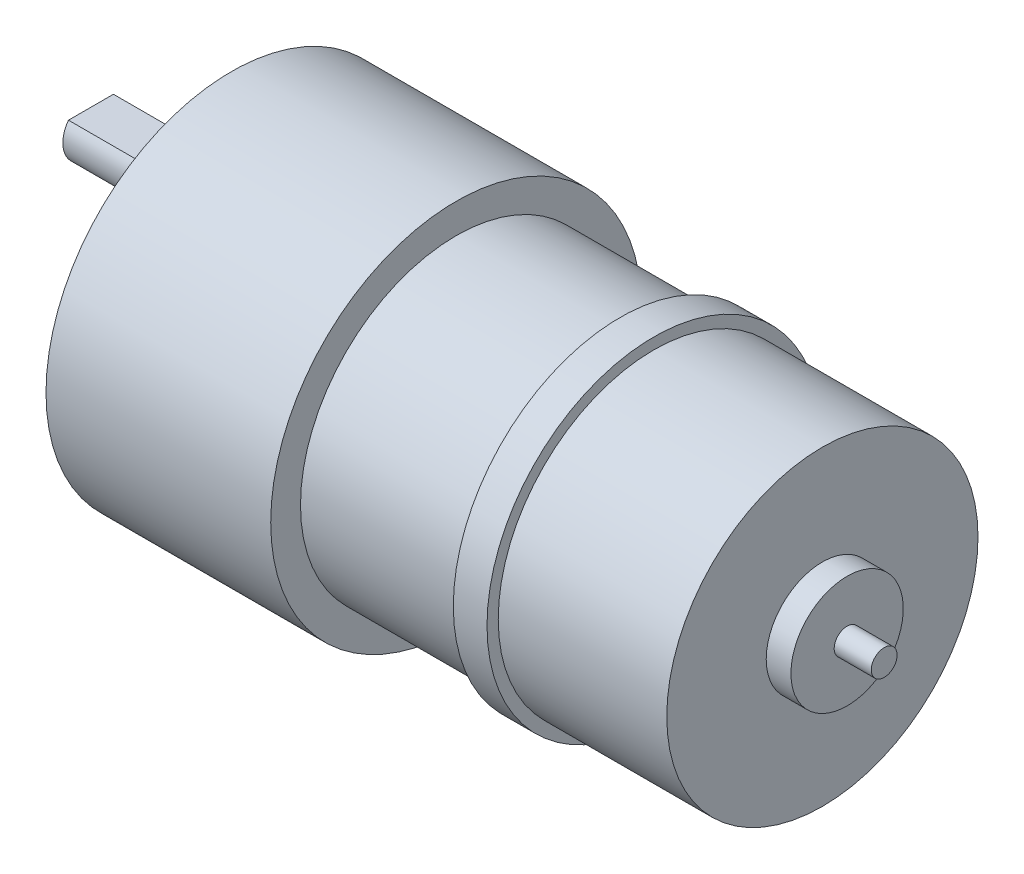
ISO-10303-21;
HEADER;
FILE_DESCRIPTION(('STEP AP214'),'2;1');
FILE_NAME('part.step','',(''),(''),'','','');
FILE_SCHEMA(('AUTOMOTIVE_DESIGN { 1 0 10303 214 1 1 1 1 }'));
ENDSEC;
DATA;
#1=APPLICATION_CONTEXT('core data for automotive mechanical design processes');
#2=APPLICATION_PROTOCOL_DEFINITION('international standard','automotive_design',2000,#1);
#3=PRODUCT_CONTEXT('',#1,'mechanical');
#4=PRODUCT('Part','Part','',(#3));
#5=PRODUCT_RELATED_PRODUCT_CATEGORY('part','',(#4));
#6=PRODUCT_DEFINITION_FORMATION('','',#4);
#7=PRODUCT_DEFINITION_CONTEXT('part definition',#1,'design');
#8=PRODUCT_DEFINITION('design','',#6,#7);
#9=PRODUCT_DEFINITION_SHAPE('','',#8);
#10=(LENGTH_UNIT() NAMED_UNIT(*) SI_UNIT(.MILLI.,.METRE.));
#11=(NAMED_UNIT(*) PLANE_ANGLE_UNIT() SI_UNIT($,.RADIAN.));
#12=(NAMED_UNIT(*) SI_UNIT($,.STERADIAN.) SOLID_ANGLE_UNIT());
#13=UNCERTAINTY_MEASURE_WITH_UNIT(LENGTH_MEASURE(1.E-05),#10,'distance_accuracy_value','');
#14=(GEOMETRIC_REPRESENTATION_CONTEXT(3) GLOBAL_UNCERTAINTY_ASSIGNED_CONTEXT((#13)) GLOBAL_UNIT_ASSIGNED_CONTEXT((#10,
#11,#12)) REPRESENTATION_CONTEXT('',''));
#15=CARTESIAN_POINT('',(0.,0.,0.));
#16=DIRECTION('',(0.,0.,1.));
#17=DIRECTION('',(1.,0.,0.));
#18=AXIS2_PLACEMENT_3D('',#15,#16,#17);
#19=CARTESIAN_POINT('',(58.1,0.,0.));
#20=DIRECTION('',(-1.,0.,0.));
#21=DIRECTION('',(0.,0.,1.));
#22=AXIS2_PLACEMENT_3D('',#19,#20,#21);
#23=PLANE('',#22);
#24=CARTESIAN_POINT('',(58.1,0.,0.));
#25=DIRECTION('',(-1.,0.,0.));
#26=DIRECTION('',(0.,0.,1.));
#27=AXIS2_PLACEMENT_3D('',#24,#25,#26);
#28=CIRCLE('',#27,1.15);
#29=CARTESIAN_POINT('',(58.1,0.,1.15));
#30=VERTEX_POINT('',#29);
#31=EDGE_CURVE('E11',#30,#30,#28,.T.);
#32=ORIENTED_EDGE('',*,*,#31,.F.);
#33=EDGE_LOOP('',(#32));
#34=FACE_BOUND('',#33,.T.);
#35=ADVANCED_FACE('F38',(#34),#23,.F.);
#36=CARTESIAN_POINT('',(0.,0.,0.));
#37=DIRECTION('',(-1.,0.,0.));
#38=DIRECTION('',(0.,0.,1.));
#39=AXIS2_PLACEMENT_3D('',#36,#37,#38);
#40=CYLINDRICAL_SURFACE('',#39,1.15);
#41=ORIENTED_EDGE('',*,*,#31,.T.);
#42=EDGE_LOOP('',(#41));
#43=FACE_BOUND('',#42,.T.);
#44=CARTESIAN_POINT('',(54.8,0.,0.));
#45=DIRECTION('',(-1.,0.,0.));
#46=DIRECTION('',(0.,0.,1.));
#47=AXIS2_PLACEMENT_3D('',#44,#45,#46);
#48=CIRCLE('',#47,1.15);
#49=CARTESIAN_POINT('',(54.8,0.,1.15));
#50=VERTEX_POINT('',#49);
#51=EDGE_CURVE('E45',#50,#50,#48,.T.);
#52=ORIENTED_EDGE('',*,*,#51,.F.);
#53=EDGE_LOOP('',(#52));
#54=FACE_BOUND('',#53,.T.);
#55=ADVANCED_FACE('F123',(#43,#54),#40,.T.);
#56=CARTESIAN_POINT('',(54.8,0.,0.));
#57=DIRECTION('',(-1.,0.,0.));
#58=DIRECTION('',(0.,0.,1.));
#59=AXIS2_PLACEMENT_3D('',#56,#57,#58);
#60=PLANE('',#59);
#61=CARTESIAN_POINT('',(54.8,0.,0.));
#62=DIRECTION('',(-1.,0.,0.));
#63=DIRECTION('',(0.,0.,1.));
#64=AXIS2_PLACEMENT_3D('',#61,#62,#63);
#65=CIRCLE('',#64,5.);
#66=CARTESIAN_POINT('',(54.8,0.,5.));
#67=VERTEX_POINT('',#66);
#68=EDGE_CURVE('E116',#67,#67,#65,.T.);
#69=ORIENTED_EDGE('',*,*,#68,.F.);
#70=EDGE_LOOP('',(#69));
#71=FACE_BOUND('',#70,.T.);
#72=ORIENTED_EDGE('',*,*,#51,.T.);
#73=EDGE_LOOP('',(#72));
#74=FACE_BOUND('',#73,.T.);
#75=ADVANCED_FACE('F121',(#71,#74),#60,.F.);
#76=CARTESIAN_POINT('',(0.,0.,0.));
#77=DIRECTION('',(-1.,0.,0.));
#78=DIRECTION('',(0.,0.,1.));
#79=AXIS2_PLACEMENT_3D('',#76,#77,#78);
#80=CYLINDRICAL_SURFACE('',#79,5.);
#81=ORIENTED_EDGE('',*,*,#68,.T.);
#82=EDGE_LOOP('',(#81));
#83=FACE_BOUND('',#82,.T.);
#84=CARTESIAN_POINT('',(52.6,0.,0.));
#85=DIRECTION('',(-1.,0.,0.));
#86=DIRECTION('',(0.,0.,1.));
#87=AXIS2_PLACEMENT_3D('',#84,#85,#86);
#88=CIRCLE('',#87,5.);
#89=CARTESIAN_POINT('',(52.6,0.,5.));
#90=VERTEX_POINT('',#89);
#91=EDGE_CURVE('E113',#90,#90,#88,.T.);
#92=ORIENTED_EDGE('',*,*,#91,.F.);
#93=EDGE_LOOP('',(#92));
#94=FACE_BOUND('',#93,.T.);
#95=ADVANCED_FACE('F130',(#83,#94),#80,.T.);
#96=CARTESIAN_POINT('',(52.6,0.,0.));
#97=DIRECTION('',(-1.,0.,0.));
#98=DIRECTION('',(0.,0.,1.));
#99=AXIS2_PLACEMENT_3D('',#96,#97,#98);
#100=PLANE('',#99);
#101=CARTESIAN_POINT('',(52.6,0.,0.));
#102=DIRECTION('',(-1.,0.,0.));
#103=DIRECTION('',(0.,0.,1.));
#104=AXIS2_PLACEMENT_3D('',#101,#102,#103);
#105=CIRCLE('',#104,13.85);
#106=CARTESIAN_POINT('',(52.6,0.,13.85));
#107=VERTEX_POINT('',#106);
#108=EDGE_CURVE('E110',#107,#107,#105,.T.);
#109=ORIENTED_EDGE('',*,*,#108,.F.);
#110=EDGE_LOOP('',(#109));
#111=FACE_BOUND('',#110,.T.);
#112=ORIENTED_EDGE('',*,*,#91,.T.);
#113=EDGE_LOOP('',(#112));
#114=FACE_BOUND('',#113,.T.);
#115=ADVANCED_FACE('F137',(#111,#114),#100,.F.);
#116=CARTESIAN_POINT('',(0.,0.,0.));
#117=DIRECTION('',(-1.,0.,0.));
#118=DIRECTION('',(0.,0.,1.));
#119=AXIS2_PLACEMENT_3D('',#116,#117,#118);
#120=CYLINDRICAL_SURFACE('',#119,13.85);
#121=ORIENTED_EDGE('',*,*,#108,.T.);
#122=EDGE_LOOP('',(#121));
#123=FACE_BOUND('',#122,.T.);
#124=CARTESIAN_POINT('',(37.6,0.,0.));
#125=DIRECTION('',(-1.,0.,0.));
#126=DIRECTION('',(0.,0.,1.));
#127=AXIS2_PLACEMENT_3D('',#124,#125,#126);
#128=CIRCLE('',#127,13.85);
#129=CARTESIAN_POINT('',(37.6,0.,13.85));
#130=VERTEX_POINT('',#129);
#131=EDGE_CURVE('E107',#130,#130,#128,.T.);
#132=ORIENTED_EDGE('',*,*,#131,.F.);
#133=EDGE_LOOP('',(#132));
#134=FACE_BOUND('',#133,.T.);
#135=ADVANCED_FACE('F141',(#123,#134),#120,.T.);
#136=CARTESIAN_POINT('',(37.6,0.,0.));
#137=DIRECTION('',(-1.,0.,0.));
#138=DIRECTION('',(0.,0.,1.));
#139=AXIS2_PLACEMENT_3D('',#136,#137,#138);
#140=PLANE('',#139);
#141=CARTESIAN_POINT('',(37.6,0.,0.));
#142=DIRECTION('',(-1.,0.,0.));
#143=DIRECTION('',(0.,0.,1.));
#144=AXIS2_PLACEMENT_3D('',#141,#142,#143);
#145=CIRCLE('',#144,14.85);
#146=CARTESIAN_POINT('',(37.6,0.,14.85));
#147=VERTEX_POINT('',#146);
#148=EDGE_CURVE('E104',#147,#147,#145,.T.);
#149=ORIENTED_EDGE('',*,*,#148,.F.);
#150=EDGE_LOOP('',(#149));
#151=FACE_BOUND('',#150,.T.);
#152=ORIENTED_EDGE('',*,*,#131,.T.);
#153=EDGE_LOOP('',(#152));
#154=FACE_BOUND('',#153,.T.);
#155=ADVANCED_FACE('F145',(#151,#154),#140,.F.);
#156=CARTESIAN_POINT('',(0.,0.,0.));
#157=DIRECTION('',(-1.,0.,0.));
#158=DIRECTION('',(0.,0.,1.));
#159=AXIS2_PLACEMENT_3D('',#156,#157,#158);
#160=CYLINDRICAL_SURFACE('',#159,14.85);
#161=ORIENTED_EDGE('',*,*,#148,.T.);
#162=EDGE_LOOP('',(#161));
#163=FACE_BOUND('',#162,.T.);
#164=CARTESIAN_POINT('',(34.6,0.,0.));
#165=DIRECTION('',(-1.,0.,0.));
#166=DIRECTION('',(0.,0.,1.));
#167=AXIS2_PLACEMENT_3D('',#164,#165,#166);
#168=CIRCLE('',#167,14.85);
#169=CARTESIAN_POINT('',(34.6,0.,14.85));
#170=VERTEX_POINT('',#169);
#171=EDGE_CURVE('E101',#170,#170,#168,.T.);
#172=ORIENTED_EDGE('',*,*,#171,.F.);
#173=EDGE_LOOP('',(#172));
#174=FACE_BOUND('',#173,.T.);
#175=ADVANCED_FACE('F149',(#163,#174),#160,.T.);
#176=CARTESIAN_POINT('',(34.6,0.,0.));
#177=DIRECTION('',(-1.,0.,0.));
#178=DIRECTION('',(0.,0.,1.));
#179=AXIS2_PLACEMENT_3D('',#176,#177,#178);
#180=PLANE('',#179);
#181=ORIENTED_EDGE('',*,*,#171,.T.);
#182=EDGE_LOOP('',(#181));
#183=FACE_BOUND('',#182,.T.);
#184=CARTESIAN_POINT('',(34.6,0.,0.));
#185=DIRECTION('',(-1.,0.,0.));
#186=DIRECTION('',(0.,0.,1.));
#187=AXIS2_PLACEMENT_3D('',#184,#185,#186);
#188=CIRCLE('',#187,13.85);
#189=CARTESIAN_POINT('',(34.6,0.,13.85));
#190=VERTEX_POINT('',#189);
#191=EDGE_CURVE('E98',#190,#190,#188,.T.);
#192=ORIENTED_EDGE('',*,*,#191,.F.);
#193=EDGE_LOOP('',(#192));
#194=FACE_BOUND('',#193,.T.);
#195=ADVANCED_FACE('F153',(#183,#194),#180,.T.);
#196=CARTESIAN_POINT('',(0.,0.,0.));
#197=DIRECTION('',(-1.,0.,0.));
#198=DIRECTION('',(0.,0.,1.));
#199=AXIS2_PLACEMENT_3D('',#196,#197,#198);
#200=CYLINDRICAL_SURFACE('',#199,13.85);
#201=ORIENTED_EDGE('',*,*,#191,.T.);
#202=EDGE_LOOP('',(#201));
#203=FACE_BOUND('',#202,.T.);
#204=CARTESIAN_POINT('',(20.,0.,0.));
#205=DIRECTION('',(-1.,0.,0.));
#206=DIRECTION('',(0.,0.,1.));
#207=AXIS2_PLACEMENT_3D('',#204,#205,#206);
#208=CIRCLE('',#207,13.85);
#209=CARTESIAN_POINT('',(20.,0.,13.85));
#210=VERTEX_POINT('',#209);
#211=EDGE_CURVE('E95',#210,#210,#208,.T.);
#212=ORIENTED_EDGE('',*,*,#211,.F.);
#213=EDGE_LOOP('',(#212));
#214=FACE_BOUND('',#213,.T.);
#215=ADVANCED_FACE('F157',(#203,#214),#200,.T.);
#216=CARTESIAN_POINT('',(20.,0.,0.));
#217=DIRECTION('',(-1.,0.,0.));
#218=DIRECTION('',(0.,0.,1.));
#219=AXIS2_PLACEMENT_3D('',#216,#217,#218);
#220=PLANE('',#219);
#221=CARTESIAN_POINT('',(20.,0.,0.));
#222=DIRECTION('',(-1.,0.,0.));
#223=DIRECTION('',(0.,0.,1.));
#224=AXIS2_PLACEMENT_3D('',#221,#222,#223);
#225=CIRCLE('',#224,16.5);
#226=CARTESIAN_POINT('',(20.,0.,16.5));
#227=VERTEX_POINT('',#226);
#228=EDGE_CURVE('E92',#227,#227,#225,.T.);
#229=ORIENTED_EDGE('',*,*,#228,.F.);
#230=EDGE_LOOP('',(#229));
#231=FACE_BOUND('',#230,.T.);
#232=ORIENTED_EDGE('',*,*,#211,.T.);
#233=EDGE_LOOP('',(#232));
#234=FACE_BOUND('',#233,.T.);
#235=ADVANCED_FACE('F161',(#231,#234),#220,.F.);
#236=CARTESIAN_POINT('',(0.,0.,0.));
#237=DIRECTION('',(-1.,0.,0.));
#238=DIRECTION('',(0.,0.,1.));
#239=AXIS2_PLACEMENT_3D('',#236,#237,#238);
#240=CYLINDRICAL_SURFACE('',#239,16.5);
#241=ORIENTED_EDGE('',*,*,#228,.T.);
#242=EDGE_LOOP('',(#241));
#243=FACE_BOUND('',#242,.T.);
#244=CARTESIAN_POINT('',(0.,0.,0.));
#245=DIRECTION('',(-1.,0.,0.));
#246=DIRECTION('',(0.,0.,1.));
#247=AXIS2_PLACEMENT_3D('',#244,#245,#246);
#248=CIRCLE('',#247,16.5);
#249=CARTESIAN_POINT('',(0.,0.,16.5));
#250=VERTEX_POINT('',#249);
#251=EDGE_CURVE('E89',#250,#250,#248,.T.);
#252=ORIENTED_EDGE('',*,*,#251,.F.);
#253=EDGE_LOOP('',(#252));
#254=FACE_BOUND('',#253,.T.);
#255=ADVANCED_FACE('F165',(#243,#254),#240,.T.);
#256=CARTESIAN_POINT('',(0.,0.,0.));
#257=DIRECTION('',(-1.,0.,0.));
#258=DIRECTION('',(0.,0.,1.));
#259=AXIS2_PLACEMENT_3D('',#256,#257,#258);
#260=PLANE('',#259);
#261=CARTESIAN_POINT('',(0.,6.,0.));
#262=DIRECTION('',(-1.,0.,0.));
#263=DIRECTION('',(0.,0.,1.));
#264=AXIS2_PLACEMENT_3D('',#261,#262,#263);
#265=CIRCLE('',#264,5.);
#266=CARTESIAN_POINT('',(0.,6.,5.));
#267=VERTEX_POINT('',#266);
#268=EDGE_CURVE('E86',#267,#267,#265,.T.);
#269=ORIENTED_EDGE('',*,*,#268,.F.);
#270=EDGE_LOOP('',(#269));
#271=FACE_BOUND('',#270,.T.);
#272=ORIENTED_EDGE('',*,*,#251,.T.);
#273=EDGE_LOOP('',(#272));
#274=FACE_BOUND('',#273,.T.);
#275=ADVANCED_FACE('F169',(#271,#274),#260,.T.);
#276=CARTESIAN_POINT('',(-12.5,6.,0.));
#277=DIRECTION('',(-1.,0.,0.));
#278=DIRECTION('',(0.,0.,1.));
#279=AXIS2_PLACEMENT_3D('',#276,#277,#278);
#280=CYLINDRICAL_SURFACE('',#279,5.);
#281=CARTESIAN_POINT('',(-2.,6.,0.));
#282=DIRECTION('',(-1.,0.,0.));
#283=DIRECTION('',(0.,0.,1.));
#284=AXIS2_PLACEMENT_3D('',#281,#282,#283);
#285=CIRCLE('',#284,5.);
#286=CARTESIAN_POINT('',(-2.,6.,5.));
#287=VERTEX_POINT('',#286);
#288=EDGE_CURVE('E80',#287,#287,#285,.T.);
#289=ORIENTED_EDGE('',*,*,#288,.F.);
#290=EDGE_LOOP('',(#289));
#291=FACE_BOUND('',#290,.T.);
#292=ORIENTED_EDGE('',*,*,#268,.T.);
#293=EDGE_LOOP('',(#292));
#294=FACE_BOUND('',#293,.T.);
#295=ADVANCED_FACE('F173',(#291,#294),#280,.T.);
#296=CARTESIAN_POINT('',(-2.,0.,0.));
#297=DIRECTION('',(-1.,0.,0.));
#298=DIRECTION('',(0.,0.,1.));
#299=AXIS2_PLACEMENT_3D('',#296,#297,#298);
#300=PLANE('',#299);
#301=ORIENTED_EDGE('',*,*,#288,.T.);
#302=EDGE_LOOP('',(#301));
#303=FACE_BOUND('',#302,.T.);
#304=CARTESIAN_POINT('',(-2.,6.,0.));
#305=DIRECTION('',(-1.,0.,0.));
#306=DIRECTION('',(0.,0.,1.));
#307=AXIS2_PLACEMENT_3D('',#304,#305,#306);
#308=CIRCLE('',#307,2.5);
#309=CARTESIAN_POINT('',(-2.,6.,2.5));
#310=VERTEX_POINT('',#309);
#311=EDGE_CURVE('E77',#310,#310,#308,.T.);
#312=ORIENTED_EDGE('',*,*,#311,.F.);
#313=EDGE_LOOP('',(#312));
#314=FACE_BOUND('',#313,.T.);
#315=ADVANCED_FACE('F177',(#303,#314),#300,.T.);
#316=CARTESIAN_POINT('',(-12.5,6.,0.));
#317=DIRECTION('',(-1.,0.,0.));
#318=DIRECTION('',(0.,0.,1.));
#319=AXIS2_PLACEMENT_3D('',#316,#317,#318);
#320=CYLINDRICAL_SURFACE('',#319,2.5);
#321=DIRECTION('',(-1.,0.,0.));
#322=VECTOR('',#321,1.);
#323=CARTESIAN_POINT('',(-4.5,7.5,2.));
#324=LINE('',#323,#322);
#325=CARTESIAN_POINT('',(-4.5,7.5,2.));
#326=VERTEX_POINT('',#325);
#327=CARTESIAN_POINT('',(-12.5,7.5,2.));
#328=VERTEX_POINT('',#327);
#329=EDGE_CURVE('E58',#326,#328,#324,.T.);
#330=ORIENTED_EDGE('',*,*,#329,.T.);
#331=CARTESIAN_POINT('',(-12.5,6.,0.));
#332=DIRECTION('',(-1.,0.,0.));
#333=DIRECTION('',(0.,0.,1.));
#334=AXIS2_PLACEMENT_3D('',#331,#332,#333);
#335=CIRCLE('',#334,2.5);
#336=CARTESIAN_POINT('',(-12.5,7.5,-2.));
#337=VERTEX_POINT('',#336);
#338=EDGE_CURVE('E74',#337,#328,#335,.T.);
#339=ORIENTED_EDGE('',*,*,#338,.F.);
#340=DIRECTION('',(-1.,0.,0.));
#341=VECTOR('',#340,1.);
#342=CARTESIAN_POINT('',(-4.5,7.5,-2.));
#343=LINE('',#342,#341);
#344=CARTESIAN_POINT('',(-4.5,7.5,-2.));
#345=VERTEX_POINT('',#344);
#346=EDGE_CURVE('E52',#345,#337,#343,.T.);
#347=ORIENTED_EDGE('',*,*,#346,.F.);
#348=CARTESIAN_POINT('',(-4.5,6.,0.));
#349=DIRECTION('',(-1.,0.,0.));
#350=DIRECTION('',(0.,0.,1.));
#351=AXIS2_PLACEMENT_3D('',#348,#349,#350);
#352=CIRCLE('',#351,2.5);
#353=EDGE_CURVE('E68',#326,#345,#352,.T.);
#354=ORIENTED_EDGE('',*,*,#353,.F.);
#355=EDGE_LOOP('',(#330,#339,#347,#354));
#356=FACE_BOUND('',#355,.T.);
#357=ORIENTED_EDGE('',*,*,#311,.T.);
#358=EDGE_LOOP('',(#357));
#359=FACE_BOUND('',#358,.T.);
#360=ADVANCED_FACE('F72',(#356,#359),#320,.T.);
#361=CARTESIAN_POINT('',(-12.5,0.,0.));
#362=DIRECTION('',(-1.,0.,0.));
#363=DIRECTION('',(0.,0.,1.));
#364=AXIS2_PLACEMENT_3D('',#361,#362,#363);
#365=PLANE('',#364);
#366=DIRECTION('',(0.,0.,1.));
#367=VECTOR('',#366,1.);
#368=CARTESIAN_POINT('',(-12.5,7.5,0.));
#369=LINE('',#368,#367);
#370=EDGE_CURVE('E63',#337,#328,#369,.T.);
#371=ORIENTED_EDGE('',*,*,#370,.F.);
#372=ORIENTED_EDGE('',*,*,#338,.T.);
#373=EDGE_LOOP('',(#371,#372));
#374=FACE_BOUND('',#373,.T.);
#375=ADVANCED_FACE('F76',(#374),#365,.T.);
#376=CARTESIAN_POINT('',(-4.5,7.5,0.));
#377=DIRECTION('',(0.,-1.,0.));
#378=DIRECTION('',(0.,0.,-1.));
#379=AXIS2_PLACEMENT_3D('',#376,#377,#378);
#380=PLANE('',#379);
#381=ORIENTED_EDGE('',*,*,#370,.T.);
#382=ORIENTED_EDGE('',*,*,#329,.F.);
#383=DIRECTION('',(0.,0.,1.));
#384=VECTOR('',#383,1.);
#385=CARTESIAN_POINT('',(-4.5,7.5,0.));
#386=LINE('',#385,#384);
#387=EDGE_CURVE('E193',#345,#326,#386,.T.);
#388=ORIENTED_EDGE('',*,*,#387,.F.);
#389=ORIENTED_EDGE('',*,*,#346,.T.);
#390=EDGE_LOOP('',(#381,#382,#388,#389));
#391=FACE_BOUND('',#390,.T.);
#392=ADVANCED_FACE('F64',(#391),#380,.F.);
#393=CARTESIAN_POINT('',(-4.5,0.,0.));
#394=DIRECTION('',(-1.,0.,0.));
#395=DIRECTION('',(0.,0.,1.));
#396=AXIS2_PLACEMENT_3D('',#393,#394,#395);
#397=PLANE('',#396);
#398=ORIENTED_EDGE('',*,*,#353,.T.);
#399=ORIENTED_EDGE('',*,*,#387,.T.);
#400=EDGE_LOOP('',(#398,#399));
#401=FACE_BOUND('',#400,.T.);
#402=ADVANCED_FACE('F188',(#401),#397,.T.);
#403=CLOSED_SHELL('',(#35,#55,#75,#95,#115,#135,#155,#175,#195,#215,#235,#255,#275,#295,#315,
#360,#375,#392,#402));
#404=MANIFOLD_SOLID_BREP('B2',#403);
#405=ADVANCED_BREP_SHAPE_REPRESENTATION('',(#18,#404),#14);
#406=SHAPE_DEFINITION_REPRESENTATION(#9,#405);
ENDSEC;
END-ISO-10303-21;
